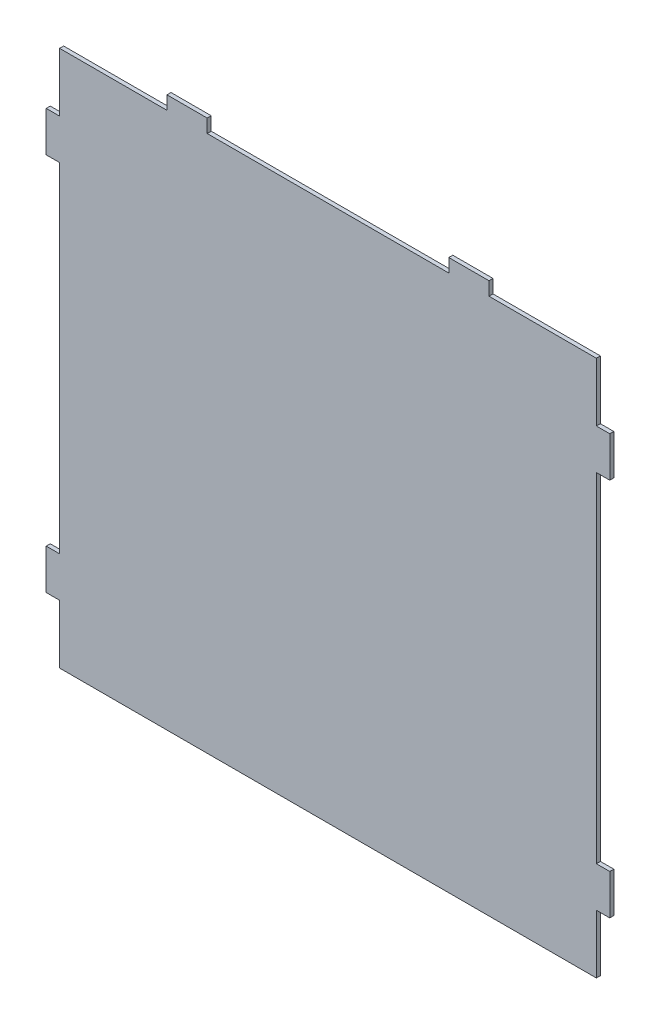
ISO-10303-21;
HEADER;
FILE_DESCRIPTION(('STEP AP214'),'2;1');
FILE_NAME('part.step','',(''),(''),'','','');
FILE_SCHEMA(('AUTOMOTIVE_DESIGN { 1 0 10303 214 1 1 1 1 }'));
ENDSEC;
DATA;
#1=APPLICATION_CONTEXT('core data for automotive mechanical design processes');
#2=APPLICATION_PROTOCOL_DEFINITION('international standard','automotive_design',2000,#1);
#3=PRODUCT_CONTEXT('',#1,'mechanical');
#4=PRODUCT('Part','Part','',(#3));
#5=PRODUCT_RELATED_PRODUCT_CATEGORY('part','',(#4));
#6=PRODUCT_DEFINITION_FORMATION('','',#4);
#7=PRODUCT_DEFINITION_CONTEXT('part definition',#1,'design');
#8=PRODUCT_DEFINITION('design','',#6,#7);
#9=PRODUCT_DEFINITION_SHAPE('','',#8);
#10=(LENGTH_UNIT() NAMED_UNIT(*) SI_UNIT(.MILLI.,.METRE.));
#11=(NAMED_UNIT(*) PLANE_ANGLE_UNIT() SI_UNIT($,.RADIAN.));
#12=(NAMED_UNIT(*) SI_UNIT($,.STERADIAN.) SOLID_ANGLE_UNIT());
#13=UNCERTAINTY_MEASURE_WITH_UNIT(LENGTH_MEASURE(1.E-05),#10,'distance_accuracy_value','');
#14=(GEOMETRIC_REPRESENTATION_CONTEXT(3) GLOBAL_UNCERTAINTY_ASSIGNED_CONTEXT((#13)) GLOBAL_UNIT_ASSIGNED_CONTEXT((#10,
#11,#12)) REPRESENTATION_CONTEXT('',''));
#15=CARTESIAN_POINT('',(0.,0.,0.));
#16=DIRECTION('',(0.,0.,1.));
#17=DIRECTION('',(1.,0.,0.));
#18=AXIS2_PLACEMENT_3D('',#15,#16,#17);
#19=CARTESIAN_POINT('',(200.,0.,3.));
#20=DIRECTION('',(1.,0.,0.));
#21=DIRECTION('',(0.,1.,0.));
#22=AXIS2_PLACEMENT_3D('',#19,#20,#21);
#23=PLANE('',#22);
#24=DIRECTION('',(0.,-1.,0.));
#25=VECTOR('',#24,1.);
#26=CARTESIAN_POINT('',(200.,0.,0.));
#27=LINE('',#26,#25);
#28=CARTESIAN_POINT('',(200.,200.,0.));
#29=VERTEX_POINT('',#28);
#30=CARTESIAN_POINT('',(200.,156.243683163479,0.));
#31=VERTEX_POINT('',#30);
#32=EDGE_CURVE('E273',#29,#31,#27,.T.);
#33=ORIENTED_EDGE('',*,*,#32,.F.);
#34=DIRECTION('',(0.,0.,-1.));
#35=VECTOR('',#34,1.);
#36=CARTESIAN_POINT('',(200.,200.,3.));
#37=LINE('',#36,#35);
#38=CARTESIAN_POINT('',(200.,200.,3.));
#39=VERTEX_POINT('',#38);
#40=EDGE_CURVE('E11',#39,#29,#37,.T.);
#41=ORIENTED_EDGE('',*,*,#40,.F.);
#42=DIRECTION('',(0.,-1.,0.));
#43=VECTOR('',#42,1.);
#44=CARTESIAN_POINT('',(200.,0.,3.));
#45=LINE('',#44,#43);
#46=CARTESIAN_POINT('',(200.,156.243683163479,3.));
#47=VERTEX_POINT('',#46);
#48=EDGE_CURVE('E267',#39,#47,#45,.T.);
#49=ORIENTED_EDGE('',*,*,#48,.T.);
#50=DIRECTION('',(0.,0.,-1.));
#51=VECTOR('',#50,1.);
#52=CARTESIAN_POINT('',(200.,156.243683163479,3.));
#53=LINE('',#52,#51);
#54=EDGE_CURVE('E161',#47,#31,#53,.T.);
#55=ORIENTED_EDGE('',*,*,#54,.T.);
#56=EDGE_LOOP('',(#33,#41,#49,#55));
#57=FACE_BOUND('',#56,.T.);
#58=ADVANCED_FACE('F49',(#57),#23,.T.);
#59=CARTESIAN_POINT('',(0.,200.,3.));
#60=DIRECTION('',(0.,1.,0.));
#61=DIRECTION('',(0.,0.,1.));
#62=AXIS2_PLACEMENT_3D('',#59,#60,#61);
#63=PLANE('',#62);
#64=DIRECTION('',(1.,0.,0.));
#65=VECTOR('',#64,1.);
#66=CARTESIAN_POINT('',(0.,200.,0.));
#67=LINE('',#66,#65);
#68=CARTESIAN_POINT('',(120.,200.,0.));
#69=VERTEX_POINT('',#68);
#70=EDGE_CURVE('E277',#69,#29,#67,.T.);
#71=ORIENTED_EDGE('',*,*,#70,.F.);
#72=DIRECTION('',(0.,0.,-1.));
#73=VECTOR('',#72,1.);
#74=CARTESIAN_POINT('',(120.,200.,3.));
#75=LINE('',#74,#73);
#76=CARTESIAN_POINT('',(120.,200.,3.));
#77=VERTEX_POINT('',#76);
#78=EDGE_CURVE('E59',#77,#69,#75,.T.);
#79=ORIENTED_EDGE('',*,*,#78,.F.);
#80=DIRECTION('',(1.,0.,0.));
#81=VECTOR('',#80,1.);
#82=CARTESIAN_POINT('',(0.,200.,3.));
#83=LINE('',#82,#81);
#84=EDGE_CURVE('E449',#77,#39,#83,.T.);
#85=ORIENTED_EDGE('',*,*,#84,.T.);
#86=ORIENTED_EDGE('',*,*,#40,.T.);
#87=EDGE_LOOP('',(#71,#79,#85,#86));
#88=FACE_BOUND('',#87,.T.);
#89=ADVANCED_FACE('F448',(#88),#63,.T.);
#90=CARTESIAN_POINT('',(120.,0.,3.));
#91=DIRECTION('',(-1.,0.,0.));
#92=DIRECTION('',(0.,0.,1.));
#93=AXIS2_PLACEMENT_3D('',#90,#91,#92);
#94=PLANE('',#93);
#95=DIRECTION('',(0.,1.,0.));
#96=VECTOR('',#95,1.);
#97=CARTESIAN_POINT('',(120.,0.,0.));
#98=LINE('',#97,#96);
#99=CARTESIAN_POINT('',(120.,210.,0.));
#100=VERTEX_POINT('',#99);
#101=EDGE_CURVE('E283',#69,#100,#98,.T.);
#102=ORIENTED_EDGE('',*,*,#101,.T.);
#103=DIRECTION('',(0.,0.,-1.));
#104=VECTOR('',#103,1.);
#105=CARTESIAN_POINT('',(120.,210.,3.));
#106=LINE('',#105,#104);
#107=CARTESIAN_POINT('',(120.,210.,3.));
#108=VERTEX_POINT('',#107);
#109=EDGE_CURVE('E433',#108,#100,#106,.T.);
#110=ORIENTED_EDGE('',*,*,#109,.F.);
#111=DIRECTION('',(0.,1.,0.));
#112=VECTOR('',#111,1.);
#113=CARTESIAN_POINT('',(120.,0.,3.));
#114=LINE('',#113,#112);
#115=EDGE_CURVE('E440',#77,#108,#114,.T.);
#116=ORIENTED_EDGE('',*,*,#115,.F.);
#117=ORIENTED_EDGE('',*,*,#78,.T.);
#118=EDGE_LOOP('',(#102,#110,#116,#117));
#119=FACE_BOUND('',#118,.T.);
#120=ADVANCED_FACE('F51',(#119),#94,.F.);
#121=CARTESIAN_POINT('',(0.,210.,3.));
#122=DIRECTION('',(0.,1.,0.));
#123=DIRECTION('',(0.,0.,1.));
#124=AXIS2_PLACEMENT_3D('',#121,#122,#123);
#125=PLANE('',#124);
#126=DIRECTION('',(1.,0.,0.));
#127=VECTOR('',#126,1.);
#128=CARTESIAN_POINT('',(0.,210.,0.));
#129=LINE('',#128,#127);
#130=CARTESIAN_POINT('',(89.9999999999999,210.,0.));
#131=VERTEX_POINT('',#130);
#132=EDGE_CURVE('E289',#131,#100,#129,.T.);
#133=ORIENTED_EDGE('',*,*,#132,.F.);
#134=DIRECTION('',(0.,0.,-1.));
#135=VECTOR('',#134,1.);
#136=CARTESIAN_POINT('',(89.9999999999999,210.,3.));
#137=LINE('',#136,#135);
#138=CARTESIAN_POINT('',(89.9999999999999,210.,3.));
#139=VERTEX_POINT('',#138);
#140=EDGE_CURVE('E430',#139,#131,#137,.T.);
#141=ORIENTED_EDGE('',*,*,#140,.F.);
#142=DIRECTION('',(1.,0.,0.));
#143=VECTOR('',#142,1.);
#144=CARTESIAN_POINT('',(0.,210.,3.));
#145=LINE('',#144,#143);
#146=EDGE_CURVE('E562',#139,#108,#145,.T.);
#147=ORIENTED_EDGE('',*,*,#146,.T.);
#148=ORIENTED_EDGE('',*,*,#109,.T.);
#149=EDGE_LOOP('',(#133,#141,#147,#148));
#150=FACE_BOUND('',#149,.T.);
#151=ADVANCED_FACE('F570',(#150),#125,.T.);
#152=CARTESIAN_POINT('',(89.9999999999999,0.,3.));
#153=DIRECTION('',(-1.,0.,0.));
#154=DIRECTION('',(0.,0.,1.));
#155=AXIS2_PLACEMENT_3D('',#152,#153,#154);
#156=PLANE('',#155);
#157=DIRECTION('',(0.,1.,0.));
#158=VECTOR('',#157,1.);
#159=CARTESIAN_POINT('',(89.9999999999999,0.,0.));
#160=LINE('',#159,#158);
#161=CARTESIAN_POINT('',(89.9999999999999,200.,0.));
#162=VERTEX_POINT('',#161);
#163=EDGE_CURVE('E293',#162,#131,#160,.T.);
#164=ORIENTED_EDGE('',*,*,#163,.F.);
#165=DIRECTION('',(0.,0.,-1.));
#166=VECTOR('',#165,1.);
#167=CARTESIAN_POINT('',(89.9999999999999,200.,3.));
#168=LINE('',#167,#166);
#169=CARTESIAN_POINT('',(89.9999999999999,200.,3.));
#170=VERTEX_POINT('',#169);
#171=EDGE_CURVE('E427',#170,#162,#168,.T.);
#172=ORIENTED_EDGE('',*,*,#171,.F.);
#173=DIRECTION('',(0.,1.,0.));
#174=VECTOR('',#173,1.);
#175=CARTESIAN_POINT('',(89.9999999999999,0.,3.));
#176=LINE('',#175,#174);
#177=EDGE_CURVE('E558',#170,#139,#176,.T.);
#178=ORIENTED_EDGE('',*,*,#177,.T.);
#179=ORIENTED_EDGE('',*,*,#140,.T.);
#180=EDGE_LOOP('',(#164,#172,#178,#179));
#181=FACE_BOUND('',#180,.T.);
#182=ADVANCED_FACE('F573',(#181),#156,.T.);
#183=CARTESIAN_POINT('',(-90.0000000000001,200.,0.));
#184=VERTEX_POINT('',#183);
#185=EDGE_CURVE('E285',#184,#162,#67,.T.);
#186=ORIENTED_EDGE('',*,*,#185,.F.);
#187=DIRECTION('',(0.,0.,-1.));
#188=VECTOR('',#187,1.);
#189=CARTESIAN_POINT('',(-90.0000000000001,200.,3.));
#190=LINE('',#189,#188);
#191=CARTESIAN_POINT('',(-90.0000000000001,200.,3.));
#192=VERTEX_POINT('',#191);
#193=EDGE_CURVE('E424',#192,#184,#190,.T.);
#194=ORIENTED_EDGE('',*,*,#193,.F.);
#195=EDGE_CURVE('E457',#192,#170,#83,.T.);
#196=ORIENTED_EDGE('',*,*,#195,.T.);
#197=ORIENTED_EDGE('',*,*,#171,.T.);
#198=EDGE_LOOP('',(#186,#194,#196,#197));
#199=FACE_BOUND('',#198,.T.);
#200=ADVANCED_FACE('F579',(#199),#63,.T.);
#201=CARTESIAN_POINT('',(-90.0000000000001,0.,3.));
#202=DIRECTION('',(-1.,0.,0.));
#203=DIRECTION('',(0.,0.,1.));
#204=AXIS2_PLACEMENT_3D('',#201,#202,#203);
#205=PLANE('',#204);
#206=DIRECTION('',(0.,1.,0.));
#207=VECTOR('',#206,1.);
#208=CARTESIAN_POINT('',(-90.0000000000001,0.,0.));
#209=LINE('',#208,#207);
#210=CARTESIAN_POINT('',(-90.0000000000001,210.,0.));
#211=VERTEX_POINT('',#210);
#212=EDGE_CURVE('E297',#184,#211,#209,.T.);
#213=ORIENTED_EDGE('',*,*,#212,.T.);
#214=DIRECTION('',(0.,0.,-1.));
#215=VECTOR('',#214,1.);
#216=CARTESIAN_POINT('',(-90.0000000000001,210.,3.));
#217=LINE('',#216,#215);
#218=CARTESIAN_POINT('',(-90.0000000000001,210.,3.));
#219=VERTEX_POINT('',#218);
#220=EDGE_CURVE('E420',#219,#211,#217,.T.);
#221=ORIENTED_EDGE('',*,*,#220,.F.);
#222=DIRECTION('',(0.,1.,0.));
#223=VECTOR('',#222,1.);
#224=CARTESIAN_POINT('',(-90.0000000000001,0.,3.));
#225=LINE('',#224,#223);
#226=EDGE_CURVE('E555',#192,#219,#225,.T.);
#227=ORIENTED_EDGE('',*,*,#226,.F.);
#228=ORIENTED_EDGE('',*,*,#193,.T.);
#229=EDGE_LOOP('',(#213,#221,#227,#228));
#230=FACE_BOUND('',#229,.T.);
#231=ADVANCED_FACE('F605',(#230),#205,.F.);
#232=CARTESIAN_POINT('',(-1.94289029309402E-13,210.,3.));
#233=DIRECTION('',(0.,-1.,0.));
#234=DIRECTION('',(1.,0.,0.));
#235=AXIS2_PLACEMENT_3D('',#232,#233,#234);
#236=PLANE('',#235);
#237=DIRECTION('',(-1.,0.,0.));
#238=VECTOR('',#237,1.);
#239=CARTESIAN_POINT('',(-1.94289029309402E-13,210.,0.));
#240=LINE('',#239,#238);
#241=CARTESIAN_POINT('',(-120.,210.,0.));
#242=VERTEX_POINT('',#241);
#243=EDGE_CURVE('E300',#211,#242,#240,.T.);
#244=ORIENTED_EDGE('',*,*,#243,.T.);
#245=DIRECTION('',(0.,0.,-1.));
#246=VECTOR('',#245,1.);
#247=CARTESIAN_POINT('',(-120.,210.,3.));
#248=LINE('',#247,#246);
#249=CARTESIAN_POINT('',(-120.,210.,3.));
#250=VERTEX_POINT('',#249);
#251=EDGE_CURVE('E417',#250,#242,#248,.T.);
#252=ORIENTED_EDGE('',*,*,#251,.F.);
#253=DIRECTION('',(-1.,0.,0.));
#254=VECTOR('',#253,1.);
#255=CARTESIAN_POINT('',(-1.94289029309402E-13,210.,3.));
#256=LINE('',#255,#254);
#257=EDGE_CURVE('E552',#219,#250,#256,.T.);
#258=ORIENTED_EDGE('',*,*,#257,.F.);
#259=ORIENTED_EDGE('',*,*,#220,.T.);
#260=EDGE_LOOP('',(#244,#252,#258,#259));
#261=FACE_BOUND('',#260,.T.);
#262=ADVANCED_FACE('F607',(#261),#236,.F.);
#263=CARTESIAN_POINT('',(-120.,0.,3.));
#264=DIRECTION('',(-1.,0.,0.));
#265=DIRECTION('',(0.,0.,1.));
#266=AXIS2_PLACEMENT_3D('',#263,#264,#265);
#267=PLANE('',#266);
#268=DIRECTION('',(0.,1.,0.));
#269=VECTOR('',#268,1.);
#270=CARTESIAN_POINT('',(-120.,0.,0.));
#271=LINE('',#270,#269);
#272=CARTESIAN_POINT('',(-120.,200.,0.));
#273=VERTEX_POINT('',#272);
#274=EDGE_CURVE('E304',#273,#242,#271,.T.);
#275=ORIENTED_EDGE('',*,*,#274,.F.);
#276=DIRECTION('',(0.,0.,-1.));
#277=VECTOR('',#276,1.);
#278=CARTESIAN_POINT('',(-120.,200.,3.));
#279=LINE('',#278,#277);
#280=CARTESIAN_POINT('',(-120.,200.,3.));
#281=VERTEX_POINT('',#280);
#282=EDGE_CURVE('E414',#281,#273,#279,.T.);
#283=ORIENTED_EDGE('',*,*,#282,.F.);
#284=DIRECTION('',(0.,1.,0.));
#285=VECTOR('',#284,1.);
#286=CARTESIAN_POINT('',(-120.,0.,3.));
#287=LINE('',#286,#285);
#288=EDGE_CURVE('E548',#281,#250,#287,.T.);
#289=ORIENTED_EDGE('',*,*,#288,.T.);
#290=ORIENTED_EDGE('',*,*,#251,.T.);
#291=EDGE_LOOP('',(#275,#283,#289,#290));
#292=FACE_BOUND('',#291,.T.);
#293=ADVANCED_FACE('F595',(#292),#267,.T.);
#294=CARTESIAN_POINT('',(-200.,200.,0.));
#295=VERTEX_POINT('',#294);
#296=EDGE_CURVE('E284',#295,#273,#67,.T.);
#297=ORIENTED_EDGE('',*,*,#296,.F.);
#298=DIRECTION('',(0.,0.,-1.));
#299=VECTOR('',#298,1.);
#300=CARTESIAN_POINT('',(-200.,200.,3.));
#301=LINE('',#300,#299);
#302=CARTESIAN_POINT('',(-200.,200.,3.));
#303=VERTEX_POINT('',#302);
#304=EDGE_CURVE('E411',#303,#295,#301,.T.);
#305=ORIENTED_EDGE('',*,*,#304,.F.);
#306=EDGE_CURVE('E456',#303,#281,#83,.T.);
#307=ORIENTED_EDGE('',*,*,#306,.T.);
#308=ORIENTED_EDGE('',*,*,#282,.T.);
#309=EDGE_LOOP('',(#297,#305,#307,#308));
#310=FACE_BOUND('',#309,.T.);
#311=ADVANCED_FACE('F587',(#310),#63,.T.);
#312=CARTESIAN_POINT('',(-200.,0.,3.));
#313=DIRECTION('',(1.,0.,0.));
#314=DIRECTION('',(0.,1.,0.));
#315=AXIS2_PLACEMENT_3D('',#312,#313,#314);
#316=PLANE('',#315);
#317=DIRECTION('',(0.,-1.,0.));
#318=VECTOR('',#317,1.);
#319=CARTESIAN_POINT('',(-200.,0.,0.));
#320=LINE('',#319,#318);
#321=CARTESIAN_POINT('',(-200.,156.243683163479,0.));
#322=VERTEX_POINT('',#321);
#323=EDGE_CURVE('E308',#295,#322,#320,.T.);
#324=ORIENTED_EDGE('',*,*,#323,.T.);
#325=DIRECTION('',(0.,0.,-1.));
#326=VECTOR('',#325,1.);
#327=CARTESIAN_POINT('',(-200.,156.243683163479,3.));
#328=LINE('',#327,#326);
#329=CARTESIAN_POINT('',(-200.,156.243683163479,3.));
#330=VERTEX_POINT('',#329);
#331=EDGE_CURVE('E407',#330,#322,#328,.T.);
#332=ORIENTED_EDGE('',*,*,#331,.F.);
#333=DIRECTION('',(0.,-1.,0.));
#334=VECTOR('',#333,1.);
#335=CARTESIAN_POINT('',(-200.,0.,3.));
#336=LINE('',#335,#334);
#337=EDGE_CURVE('E476',#303,#330,#336,.T.);
#338=ORIENTED_EDGE('',*,*,#337,.F.);
#339=ORIENTED_EDGE('',*,*,#304,.T.);
#340=EDGE_LOOP('',(#324,#332,#338,#339));
#341=FACE_BOUND('',#340,.T.);
#342=ADVANCED_FACE('F645',(#341),#316,.F.);
#343=CARTESIAN_POINT('',(0.,156.243683163479,3.));
#344=DIRECTION('',(0.,-1.,0.));
#345=DIRECTION('',(0.,0.,-1.));
#346=AXIS2_PLACEMENT_3D('',#343,#344,#345);
#347=PLANE('',#346);
#348=DIRECTION('',(-1.,0.,0.));
#349=VECTOR('',#348,1.);
#350=CARTESIAN_POINT('',(0.,156.243683163479,0.));
#351=LINE('',#350,#349);
#352=CARTESIAN_POINT('',(-210.,156.243683163479,0.));
#353=VERTEX_POINT('',#352);
#354=EDGE_CURVE('E311',#322,#353,#351,.T.);
#355=ORIENTED_EDGE('',*,*,#354,.T.);
#356=DIRECTION('',(0.,0.,-1.));
#357=VECTOR('',#356,1.);
#358=CARTESIAN_POINT('',(-210.,156.243683163479,3.));
#359=LINE('',#358,#357);
#360=CARTESIAN_POINT('',(-210.,156.243683163479,3.));
#361=VERTEX_POINT('',#360);
#362=EDGE_CURVE('E404',#361,#353,#359,.T.);
#363=ORIENTED_EDGE('',*,*,#362,.F.);
#364=DIRECTION('',(-1.,0.,0.));
#365=VECTOR('',#364,1.);
#366=CARTESIAN_POINT('',(0.,156.243683163479,3.));
#367=LINE('',#366,#365);
#368=EDGE_CURVE('E544',#330,#361,#367,.T.);
#369=ORIENTED_EDGE('',*,*,#368,.F.);
#370=ORIENTED_EDGE('',*,*,#331,.T.);
#371=EDGE_LOOP('',(#355,#363,#369,#370));
#372=FACE_BOUND('',#371,.T.);
#373=ADVANCED_FACE('F660',(#372),#347,.F.);
#374=CARTESIAN_POINT('',(-210.,0.,3.));
#375=DIRECTION('',(-1.,0.,0.));
#376=DIRECTION('',(0.,0.,1.));
#377=AXIS2_PLACEMENT_3D('',#374,#375,#376);
#378=PLANE('',#377);
#379=DIRECTION('',(0.,1.,0.));
#380=VECTOR('',#379,1.);
#381=CARTESIAN_POINT('',(-210.,0.,0.));
#382=LINE('',#381,#380);
#383=CARTESIAN_POINT('',(-210.,126.243683163479,0.));
#384=VERTEX_POINT('',#383);
#385=EDGE_CURVE('E317',#384,#353,#382,.T.);
#386=ORIENTED_EDGE('',*,*,#385,.F.);
#387=DIRECTION('',(0.,0.,-1.));
#388=VECTOR('',#387,1.);
#389=CARTESIAN_POINT('',(-210.,126.243683163479,3.));
#390=LINE('',#389,#388);
#391=CARTESIAN_POINT('',(-210.,126.243683163479,3.));
#392=VERTEX_POINT('',#391);
#393=EDGE_CURVE('E401',#392,#384,#390,.T.);
#394=ORIENTED_EDGE('',*,*,#393,.F.);
#395=DIRECTION('',(0.,1.,0.));
#396=VECTOR('',#395,1.);
#397=CARTESIAN_POINT('',(-210.,0.,3.));
#398=LINE('',#397,#396);
#399=EDGE_CURVE('E540',#392,#361,#398,.T.);
#400=ORIENTED_EDGE('',*,*,#399,.T.);
#401=ORIENTED_EDGE('',*,*,#362,.T.);
#402=EDGE_LOOP('',(#386,#394,#400,#401));
#403=FACE_BOUND('',#402,.T.);
#404=ADVANCED_FACE('F656',(#403),#378,.T.);
#405=CARTESIAN_POINT('',(0.,126.243683163479,3.));
#406=DIRECTION('',(0.,-1.,0.));
#407=DIRECTION('',(0.,0.,-1.));
#408=AXIS2_PLACEMENT_3D('',#405,#406,#407);
#409=PLANE('',#408);
#410=DIRECTION('',(-1.,0.,0.));
#411=VECTOR('',#410,1.);
#412=CARTESIAN_POINT('',(0.,126.243683163479,0.));
#413=LINE('',#412,#411);
#414=CARTESIAN_POINT('',(-200.,126.243683163479,0.));
#415=VERTEX_POINT('',#414);
#416=EDGE_CURVE('E321',#415,#384,#413,.T.);
#417=ORIENTED_EDGE('',*,*,#416,.F.);
#418=DIRECTION('',(0.,0.,-1.));
#419=VECTOR('',#418,1.);
#420=CARTESIAN_POINT('',(-200.,126.243683163479,3.));
#421=LINE('',#420,#419);
#422=CARTESIAN_POINT('',(-200.,126.243683163479,3.));
#423=VERTEX_POINT('',#422);
#424=EDGE_CURVE('E398',#423,#415,#421,.T.);
#425=ORIENTED_EDGE('',*,*,#424,.F.);
#426=DIRECTION('',(-1.,0.,0.));
#427=VECTOR('',#426,1.);
#428=CARTESIAN_POINT('',(0.,126.243683163479,3.));
#429=LINE('',#428,#427);
#430=EDGE_CURVE('E536',#423,#392,#429,.T.);
#431=ORIENTED_EDGE('',*,*,#430,.T.);
#432=ORIENTED_EDGE('',*,*,#393,.T.);
#433=EDGE_LOOP('',(#417,#425,#431,#432));
#434=FACE_BOUND('',#433,.T.);
#435=ADVANCED_FACE('F653',(#434),#409,.T.);
#436=CARTESIAN_POINT('',(-200.,-126.243683163479,0.));
#437=VERTEX_POINT('',#436);
#438=EDGE_CURVE('E313',#415,#437,#320,.T.);
#439=ORIENTED_EDGE('',*,*,#438,.T.);
#440=DIRECTION('',(0.,0.,-1.));
#441=VECTOR('',#440,1.);
#442=CARTESIAN_POINT('',(-200.,-126.243683163479,3.));
#443=LINE('',#442,#441);
#444=CARTESIAN_POINT('',(-200.,-126.243683163479,3.));
#445=VERTEX_POINT('',#444);
#446=EDGE_CURVE('E394',#445,#437,#443,.T.);
#447=ORIENTED_EDGE('',*,*,#446,.F.);
#448=EDGE_CURVE('E475',#423,#445,#336,.T.);
#449=ORIENTED_EDGE('',*,*,#448,.F.);
#450=ORIENTED_EDGE('',*,*,#424,.T.);
#451=EDGE_LOOP('',(#439,#447,#449,#450));
#452=FACE_BOUND('',#451,.T.);
#453=ADVANCED_FACE('F515',(#452),#316,.F.);
#454=CARTESIAN_POINT('',(0.,-126.243683163479,3.));
#455=DIRECTION('',(0.,-1.,0.));
#456=DIRECTION('',(0.,0.,-1.));
#457=AXIS2_PLACEMENT_3D('',#454,#455,#456);
#458=PLANE('',#457);
#459=DIRECTION('',(-1.,0.,0.));
#460=VECTOR('',#459,1.);
#461=CARTESIAN_POINT('',(0.,-126.243683163479,0.));
#462=LINE('',#461,#460);
#463=CARTESIAN_POINT('',(-210.,-126.243683163479,0.));
#464=VERTEX_POINT('',#463);
#465=EDGE_CURVE('E325',#437,#464,#462,.T.);
#466=ORIENTED_EDGE('',*,*,#465,.T.);
#467=DIRECTION('',(0.,0.,-1.));
#468=VECTOR('',#467,1.);
#469=CARTESIAN_POINT('',(-210.,-126.243683163479,3.));
#470=LINE('',#469,#468);
#471=CARTESIAN_POINT('',(-210.,-126.243683163479,3.));
#472=VERTEX_POINT('',#471);
#473=EDGE_CURVE('E390',#472,#464,#470,.T.);
#474=ORIENTED_EDGE('',*,*,#473,.F.);
#475=DIRECTION('',(-1.,0.,0.));
#476=VECTOR('',#475,1.);
#477=CARTESIAN_POINT('',(0.,-126.243683163479,3.));
#478=LINE('',#477,#476);
#479=EDGE_CURVE('E523',#445,#472,#478,.T.);
#480=ORIENTED_EDGE('',*,*,#479,.F.);
#481=ORIENTED_EDGE('',*,*,#446,.T.);
#482=EDGE_LOOP('',(#466,#474,#480,#481));
#483=FACE_BOUND('',#482,.T.);
#484=ADVANCED_FACE('F521',(#483),#458,.F.);
#485=CARTESIAN_POINT('',(-210.,0.,3.));
#486=DIRECTION('',(1.,0.,0.));
#487=DIRECTION('',(0.,0.,-1.));
#488=AXIS2_PLACEMENT_3D('',#485,#486,#487);
#489=PLANE('',#488);
#490=DIRECTION('',(0.,-1.,0.));
#491=VECTOR('',#490,1.);
#492=CARTESIAN_POINT('',(-210.,0.,0.));
#493=LINE('',#492,#491);
#494=CARTESIAN_POINT('',(-210.,-156.243683163479,0.));
#495=VERTEX_POINT('',#494);
#496=EDGE_CURVE('E328',#464,#495,#493,.T.);
#497=ORIENTED_EDGE('',*,*,#496,.T.);
#498=DIRECTION('',(0.,0.,-1.));
#499=VECTOR('',#498,1.);
#500=CARTESIAN_POINT('',(-210.,-156.243683163479,3.));
#501=LINE('',#500,#499);
#502=CARTESIAN_POINT('',(-210.,-156.243683163479,3.));
#503=VERTEX_POINT('',#502);
#504=EDGE_CURVE('E387',#503,#495,#501,.T.);
#505=ORIENTED_EDGE('',*,*,#504,.F.);
#506=DIRECTION('',(0.,-1.,0.));
#507=VECTOR('',#506,1.);
#508=CARTESIAN_POINT('',(-210.,0.,3.));
#509=LINE('',#508,#507);
#510=EDGE_CURVE('E530',#472,#503,#509,.T.);
#511=ORIENTED_EDGE('',*,*,#510,.F.);
#512=ORIENTED_EDGE('',*,*,#473,.T.);
#513=EDGE_LOOP('',(#497,#505,#511,#512));
#514=FACE_BOUND('',#513,.T.);
#515=ADVANCED_FACE('F527',(#514),#489,.F.);
#516=CARTESIAN_POINT('',(0.,-156.243683163479,3.));
#517=DIRECTION('',(0.,-1.,0.));
#518=DIRECTION('',(0.,0.,-1.));
#519=AXIS2_PLACEMENT_3D('',#516,#517,#518);
#520=PLANE('',#519);
#521=DIRECTION('',(-1.,0.,0.));
#522=VECTOR('',#521,1.);
#523=CARTESIAN_POINT('',(0.,-156.243683163479,0.));
#524=LINE('',#523,#522);
#525=CARTESIAN_POINT('',(-200.,-156.243683163479,0.));
#526=VERTEX_POINT('',#525);
#527=EDGE_CURVE('E332',#526,#495,#524,.T.);
#528=ORIENTED_EDGE('',*,*,#527,.F.);
#529=DIRECTION('',(0.,0.,-1.));
#530=VECTOR('',#529,1.);
#531=CARTESIAN_POINT('',(-200.,-156.243683163479,3.));
#532=LINE('',#531,#530);
#533=CARTESIAN_POINT('',(-200.,-156.243683163479,3.));
#534=VERTEX_POINT('',#533);
#535=EDGE_CURVE('E384',#534,#526,#532,.T.);
#536=ORIENTED_EDGE('',*,*,#535,.F.);
#537=DIRECTION('',(-1.,0.,0.));
#538=VECTOR('',#537,1.);
#539=CARTESIAN_POINT('',(0.,-156.243683163479,3.));
#540=LINE('',#539,#538);
#541=EDGE_CURVE('E473',#534,#503,#540,.T.);
#542=ORIENTED_EDGE('',*,*,#541,.T.);
#543=ORIENTED_EDGE('',*,*,#504,.T.);
#544=EDGE_LOOP('',(#528,#536,#542,#543));
#545=FACE_BOUND('',#544,.T.);
#546=ADVANCED_FACE('F644',(#545),#520,.T.);
#547=CARTESIAN_POINT('',(-200.,-200.,0.));
#548=VERTEX_POINT('',#547);
#549=EDGE_CURVE('E312',#526,#548,#320,.T.);
#550=ORIENTED_EDGE('',*,*,#549,.T.);
#551=DIRECTION('',(0.,0.,-1.));
#552=VECTOR('',#551,1.);
#553=CARTESIAN_POINT('',(-200.,-200.,3.));
#554=LINE('',#553,#552);
#555=CARTESIAN_POINT('',(-200.,-200.,3.));
#556=VERTEX_POINT('',#555);
#557=EDGE_CURVE('E380',#556,#548,#554,.T.);
#558=ORIENTED_EDGE('',*,*,#557,.F.);
#559=EDGE_CURVE('E468',#534,#556,#336,.T.);
#560=ORIENTED_EDGE('',*,*,#559,.F.);
#561=ORIENTED_EDGE('',*,*,#535,.T.);
#562=EDGE_LOOP('',(#550,#558,#560,#561));
#563=FACE_BOUND('',#562,.T.);
#564=ADVANCED_FACE('F507',(#563),#316,.F.);
#565=CARTESIAN_POINT('',(0.,-200.,3.));
#566=DIRECTION('',(0.,1.,0.));
#567=DIRECTION('',(0.,0.,1.));
#568=AXIS2_PLACEMENT_3D('',#565,#566,#567);
#569=PLANE('',#568);
#570=DIRECTION('',(1.,0.,0.));
#571=VECTOR('',#570,1.);
#572=CARTESIAN_POINT('',(0.,-200.,0.));
#573=LINE('',#572,#571);
#574=CARTESIAN_POINT('',(200.,-200.,0.));
#575=VERTEX_POINT('',#574);
#576=EDGE_CURVE('E336',#548,#575,#573,.T.);
#577=ORIENTED_EDGE('',*,*,#576,.T.);
#578=DIRECTION('',(0.,0.,-1.));
#579=VECTOR('',#578,1.);
#580=CARTESIAN_POINT('',(200.,-200.,3.));
#581=LINE('',#580,#579);
#582=CARTESIAN_POINT('',(200.,-200.,3.));
#583=VERTEX_POINT('',#582);
#584=EDGE_CURVE('E377',#583,#575,#581,.T.);
#585=ORIENTED_EDGE('',*,*,#584,.F.);
#586=DIRECTION('',(1.,0.,0.));
#587=VECTOR('',#586,1.);
#588=CARTESIAN_POINT('',(0.,-200.,3.));
#589=LINE('',#588,#587);
#590=EDGE_CURVE('E461',#556,#583,#589,.T.);
#591=ORIENTED_EDGE('',*,*,#590,.F.);
#592=ORIENTED_EDGE('',*,*,#557,.T.);
#593=EDGE_LOOP('',(#577,#585,#591,#592));
#594=FACE_BOUND('',#593,.T.);
#595=ADVANCED_FACE('F503',(#594),#569,.F.);
#596=CARTESIAN_POINT('',(200.,-156.243683163479,0.));
#597=VERTEX_POINT('',#596);
#598=EDGE_CURVE('E279',#597,#575,#27,.T.);
#599=ORIENTED_EDGE('',*,*,#598,.F.);
#600=DIRECTION('',(0.,0.,-1.));
#601=VECTOR('',#600,1.);
#602=CARTESIAN_POINT('',(200.,-156.243683163479,3.));
#603=LINE('',#602,#601);
#604=CARTESIAN_POINT('',(200.,-156.243683163479,3.));
#605=VERTEX_POINT('',#604);
#606=EDGE_CURVE('E374',#605,#597,#603,.T.);
#607=ORIENTED_EDGE('',*,*,#606,.F.);
#608=EDGE_CURVE('E266',#605,#583,#45,.T.);
#609=ORIENTED_EDGE('',*,*,#608,.T.);
#610=ORIENTED_EDGE('',*,*,#584,.T.);
#611=EDGE_LOOP('',(#599,#607,#609,#610));
#612=FACE_BOUND('',#611,.T.);
#613=ADVANCED_FACE('F500',(#612),#23,.T.);
#614=CARTESIAN_POINT('',(0.,-156.243683163479,3.));
#615=DIRECTION('',(0.,1.,0.));
#616=DIRECTION('',(0.,0.,1.));
#617=AXIS2_PLACEMENT_3D('',#614,#615,#616);
#618=PLANE('',#617);
#619=DIRECTION('',(1.,0.,0.));
#620=VECTOR('',#619,1.);
#621=CARTESIAN_POINT('',(0.,-156.243683163479,0.));
#622=LINE('',#621,#620);
#623=CARTESIAN_POINT('',(210.,-156.243683163479,0.));
#624=VERTEX_POINT('',#623);
#625=EDGE_CURVE('E340',#597,#624,#622,.T.);
#626=ORIENTED_EDGE('',*,*,#625,.T.);
#627=DIRECTION('',(0.,0.,-1.));
#628=VECTOR('',#627,1.);
#629=CARTESIAN_POINT('',(210.,-156.243683163479,3.));
#630=LINE('',#629,#628);
#631=CARTESIAN_POINT('',(210.,-156.243683163479,3.));
#632=VERTEX_POINT('',#631);
#633=EDGE_CURVE('E371',#632,#624,#630,.T.);
#634=ORIENTED_EDGE('',*,*,#633,.F.);
#635=DIRECTION('',(1.,0.,0.));
#636=VECTOR('',#635,1.);
#637=CARTESIAN_POINT('',(0.,-156.243683163479,3.));
#638=LINE('',#637,#636);
#639=EDGE_CURVE('E460',#605,#632,#638,.T.);
#640=ORIENTED_EDGE('',*,*,#639,.F.);
#641=ORIENTED_EDGE('',*,*,#606,.T.);
#642=EDGE_LOOP('',(#626,#634,#640,#641));
#643=FACE_BOUND('',#642,.T.);
#644=ADVANCED_FACE('F625',(#643),#618,.F.);
#645=CARTESIAN_POINT('',(210.,3.88578058618805E-13,3.));
#646=DIRECTION('',(1.,0.,0.));
#647=DIRECTION('',(0.,1.,0.));
#648=AXIS2_PLACEMENT_3D('',#645,#646,#647);
#649=PLANE('',#648);
#650=DIRECTION('',(0.,-1.,0.));
#651=VECTOR('',#650,1.);
#652=CARTESIAN_POINT('',(210.,3.88578058618805E-13,0.));
#653=LINE('',#652,#651);
#654=CARTESIAN_POINT('',(210.,-126.243683163479,0.));
#655=VERTEX_POINT('',#654);
#656=EDGE_CURVE('E344',#655,#624,#653,.T.);
#657=ORIENTED_EDGE('',*,*,#656,.F.);
#658=DIRECTION('',(0.,0.,-1.));
#659=VECTOR('',#658,1.);
#660=CARTESIAN_POINT('',(210.,-126.243683163479,3.));
#661=LINE('',#660,#659);
#662=CARTESIAN_POINT('',(210.,-126.243683163479,3.));
#663=VERTEX_POINT('',#662);
#664=EDGE_CURVE('E368',#663,#655,#661,.T.);
#665=ORIENTED_EDGE('',*,*,#664,.F.);
#666=DIRECTION('',(0.,-1.,0.));
#667=VECTOR('',#666,1.);
#668=CARTESIAN_POINT('',(210.,3.88578058618805E-13,3.));
#669=LINE('',#668,#667);
#670=EDGE_CURVE('E466',#663,#632,#669,.T.);
#671=ORIENTED_EDGE('',*,*,#670,.T.);
#672=ORIENTED_EDGE('',*,*,#633,.T.);
#673=EDGE_LOOP('',(#657,#665,#671,#672));
#674=FACE_BOUND('',#673,.T.);
#675=ADVANCED_FACE('F631',(#674),#649,.T.);
#676=CARTESIAN_POINT('',(0.,-126.243683163479,3.));
#677=DIRECTION('',(0.,1.,0.));
#678=DIRECTION('',(0.,0.,1.));
#679=AXIS2_PLACEMENT_3D('',#676,#677,#678);
#680=PLANE('',#679);
#681=DIRECTION('',(1.,0.,0.));
#682=VECTOR('',#681,1.);
#683=CARTESIAN_POINT('',(0.,-126.243683163479,0.));
#684=LINE('',#683,#682);
#685=CARTESIAN_POINT('',(200.,-126.243683163479,0.));
#686=VERTEX_POINT('',#685);
#687=EDGE_CURVE('E348',#686,#655,#684,.T.);
#688=ORIENTED_EDGE('',*,*,#687,.F.);
#689=DIRECTION('',(0.,0.,-1.));
#690=VECTOR('',#689,1.);
#691=CARTESIAN_POINT('',(200.,-126.243683163479,3.));
#692=LINE('',#691,#690);
#693=CARTESIAN_POINT('',(200.,-126.243683163479,3.));
#694=VERTEX_POINT('',#693);
#695=EDGE_CURVE('E365',#694,#686,#692,.T.);
#696=ORIENTED_EDGE('',*,*,#695,.F.);
#697=DIRECTION('',(1.,0.,0.));
#698=VECTOR('',#697,1.);
#699=CARTESIAN_POINT('',(0.,-126.243683163479,3.));
#700=LINE('',#699,#698);
#701=EDGE_CURVE('E264',#694,#663,#700,.T.);
#702=ORIENTED_EDGE('',*,*,#701,.T.);
#703=ORIENTED_EDGE('',*,*,#664,.T.);
#704=EDGE_LOOP('',(#688,#696,#702,#703));
#705=FACE_BOUND('',#704,.T.);
#706=ADVANCED_FACE('F487',(#705),#680,.T.);
#707=CARTESIAN_POINT('',(200.,126.243683163479,0.));
#708=VERTEX_POINT('',#707);
#709=EDGE_CURVE('E278',#708,#686,#27,.T.);
#710=ORIENTED_EDGE('',*,*,#709,.F.);
#711=DIRECTION('',(0.,0.,-1.));
#712=VECTOR('',#711,1.);
#713=CARTESIAN_POINT('',(200.,126.243683163479,3.));
#714=LINE('',#713,#712);
#715=CARTESIAN_POINT('',(200.,126.243683163479,3.));
#716=VERTEX_POINT('',#715);
#717=EDGE_CURVE('E249',#716,#708,#714,.T.);
#718=ORIENTED_EDGE('',*,*,#717,.F.);
#719=EDGE_CURVE('E260',#716,#694,#45,.T.);
#720=ORIENTED_EDGE('',*,*,#719,.T.);
#721=ORIENTED_EDGE('',*,*,#695,.T.);
#722=EDGE_LOOP('',(#710,#718,#720,#721));
#723=FACE_BOUND('',#722,.T.);
#724=ADVANCED_FACE('F491',(#723),#23,.T.);
#725=CARTESIAN_POINT('',(0.,126.243683163479,3.));
#726=DIRECTION('',(0.,-1.,0.));
#727=DIRECTION('',(0.,0.,-1.));
#728=AXIS2_PLACEMENT_3D('',#725,#726,#727);
#729=PLANE('',#728);
#730=DIRECTION('',(-1.,0.,0.));
#731=VECTOR('',#730,1.);
#732=CARTESIAN_POINT('',(0.,126.243683163479,0.));
#733=LINE('',#732,#731);
#734=CARTESIAN_POINT('',(210.,126.243683163479,0.));
#735=VERTEX_POINT('',#734);
#736=EDGE_CURVE('E247',#735,#708,#733,.T.);
#737=ORIENTED_EDGE('',*,*,#736,.F.);
#738=DIRECTION('',(0.,0.,-1.));
#739=VECTOR('',#738,1.);
#740=CARTESIAN_POINT('',(210.,126.243683163479,3.));
#741=LINE('',#740,#739);
#742=CARTESIAN_POINT('',(210.,126.243683163479,3.));
#743=VERTEX_POINT('',#742);
#744=EDGE_CURVE('E241',#743,#735,#741,.T.);
#745=ORIENTED_EDGE('',*,*,#744,.F.);
#746=DIRECTION('',(-1.,0.,0.));
#747=VECTOR('',#746,1.);
#748=CARTESIAN_POINT('',(0.,126.243683163479,3.));
#749=LINE('',#748,#747);
#750=EDGE_CURVE('E245',#743,#716,#749,.T.);
#751=ORIENTED_EDGE('',*,*,#750,.T.);
#752=ORIENTED_EDGE('',*,*,#717,.T.);
#753=EDGE_LOOP('',(#737,#745,#751,#752));
#754=FACE_BOUND('',#753,.T.);
#755=ADVANCED_FACE('F243',(#754),#729,.T.);
#756=CARTESIAN_POINT('',(210.,3.88578058618805E-13,3.));
#757=DIRECTION('',(-1.,0.,0.));
#758=DIRECTION('',(0.,-1.,0.));
#759=AXIS2_PLACEMENT_3D('',#756,#757,#758);
#760=PLANE('',#759);
#761=DIRECTION('',(0.,1.,0.));
#762=VECTOR('',#761,1.);
#763=CARTESIAN_POINT('',(210.,3.88578058618805E-13,0.));
#764=LINE('',#763,#762);
#765=CARTESIAN_POINT('',(210.,156.243683163479,0.));
#766=VERTEX_POINT('',#765);
#767=EDGE_CURVE('E154',#735,#766,#764,.T.);
#768=ORIENTED_EDGE('',*,*,#767,.T.);
#769=DIRECTION('',(0.,0.,-1.));
#770=VECTOR('',#769,1.);
#771=CARTESIAN_POINT('',(210.,156.243683163479,3.));
#772=LINE('',#771,#770);
#773=CARTESIAN_POINT('',(210.,156.243683163479,3.));
#774=VERTEX_POINT('',#773);
#775=EDGE_CURVE('E250',#774,#766,#772,.T.);
#776=ORIENTED_EDGE('',*,*,#775,.F.);
#777=DIRECTION('',(0.,1.,0.));
#778=VECTOR('',#777,1.);
#779=CARTESIAN_POINT('',(210.,3.88578058618805E-13,3.));
#780=LINE('',#779,#778);
#781=EDGE_CURVE('E252',#743,#774,#780,.T.);
#782=ORIENTED_EDGE('',*,*,#781,.F.);
#783=ORIENTED_EDGE('',*,*,#744,.T.);
#784=EDGE_LOOP('',(#768,#776,#782,#783));
#785=FACE_BOUND('',#784,.T.);
#786=ADVANCED_FACE('F253',(#785),#760,.F.);
#787=CARTESIAN_POINT('',(0.,156.243683163479,3.));
#788=DIRECTION('',(0.,-1.,0.));
#789=DIRECTION('',(0.,0.,-1.));
#790=AXIS2_PLACEMENT_3D('',#787,#788,#789);
#791=PLANE('',#790);
#792=DIRECTION('',(-1.,0.,0.));
#793=VECTOR('',#792,1.);
#794=CARTESIAN_POINT('',(0.,156.243683163479,0.));
#795=LINE('',#794,#793);
#796=EDGE_CURVE('E356',#766,#31,#795,.T.);
#797=ORIENTED_EDGE('',*,*,#796,.T.);
#798=ORIENTED_EDGE('',*,*,#54,.F.);
#799=DIRECTION('',(-1.,0.,0.));
#800=VECTOR('',#799,1.);
#801=CARTESIAN_POINT('',(0.,156.243683163479,3.));
#802=LINE('',#801,#800);
#803=EDGE_CURVE('E67',#774,#47,#802,.T.);
#804=ORIENTED_EDGE('',*,*,#803,.F.);
#805=ORIENTED_EDGE('',*,*,#775,.T.);
#806=EDGE_LOOP('',(#797,#798,#804,#805));
#807=FACE_BOUND('',#806,.T.);
#808=ADVANCED_FACE('F452',(#807),#791,.F.);
#809=CARTESIAN_POINT('',(0.,0.,3.));
#810=DIRECTION('',(0.,0.,1.));
#811=DIRECTION('',(1.,0.,0.));
#812=AXIS2_PLACEMENT_3D('',#809,#810,#811);
#813=PLANE('',#812);
#814=ORIENTED_EDGE('',*,*,#48,.F.);
#815=ORIENTED_EDGE('',*,*,#84,.F.);
#816=ORIENTED_EDGE('',*,*,#115,.T.);
#817=ORIENTED_EDGE('',*,*,#146,.F.);
#818=ORIENTED_EDGE('',*,*,#177,.F.);
#819=ORIENTED_EDGE('',*,*,#195,.F.);
#820=ORIENTED_EDGE('',*,*,#226,.T.);
#821=ORIENTED_EDGE('',*,*,#257,.T.);
#822=ORIENTED_EDGE('',*,*,#288,.F.);
#823=ORIENTED_EDGE('',*,*,#306,.F.);
#824=ORIENTED_EDGE('',*,*,#337,.T.);
#825=ORIENTED_EDGE('',*,*,#368,.T.);
#826=ORIENTED_EDGE('',*,*,#399,.F.);
#827=ORIENTED_EDGE('',*,*,#430,.F.);
#828=ORIENTED_EDGE('',*,*,#448,.T.);
#829=ORIENTED_EDGE('',*,*,#479,.T.);
#830=ORIENTED_EDGE('',*,*,#510,.T.);
#831=ORIENTED_EDGE('',*,*,#541,.F.);
#832=ORIENTED_EDGE('',*,*,#559,.T.);
#833=ORIENTED_EDGE('',*,*,#590,.T.);
#834=ORIENTED_EDGE('',*,*,#608,.F.);
#835=ORIENTED_EDGE('',*,*,#639,.T.);
#836=ORIENTED_EDGE('',*,*,#670,.F.);
#837=ORIENTED_EDGE('',*,*,#701,.F.);
#838=ORIENTED_EDGE('',*,*,#719,.F.);
#839=ORIENTED_EDGE('',*,*,#750,.F.);
#840=ORIENTED_EDGE('',*,*,#781,.T.);
#841=ORIENTED_EDGE('',*,*,#803,.T.);
#842=EDGE_LOOP('',(#814,#815,#816,#817,#818,#819,#820,#821,#822,#823,#824,#825,#826,#827,#828,
#829,#830,#831,#832,#833,#834,#835,#836,#837,#838,#839,#840,#841));
#843=FACE_BOUND('',#842,.T.);
#844=ADVANCED_FACE('F257',(#843),#813,.T.);
#845=CARTESIAN_POINT('',(0.,0.,0.));
#846=DIRECTION('',(0.,0.,1.));
#847=DIRECTION('',(1.,0.,0.));
#848=AXIS2_PLACEMENT_3D('',#845,#846,#847);
#849=PLANE('',#848);
#850=ORIENTED_EDGE('',*,*,#32,.T.);
#851=ORIENTED_EDGE('',*,*,#796,.F.);
#852=ORIENTED_EDGE('',*,*,#767,.F.);
#853=ORIENTED_EDGE('',*,*,#736,.T.);
#854=ORIENTED_EDGE('',*,*,#709,.T.);
#855=ORIENTED_EDGE('',*,*,#687,.T.);
#856=ORIENTED_EDGE('',*,*,#656,.T.);
#857=ORIENTED_EDGE('',*,*,#625,.F.);
#858=ORIENTED_EDGE('',*,*,#598,.T.);
#859=ORIENTED_EDGE('',*,*,#576,.F.);
#860=ORIENTED_EDGE('',*,*,#549,.F.);
#861=ORIENTED_EDGE('',*,*,#527,.T.);
#862=ORIENTED_EDGE('',*,*,#496,.F.);
#863=ORIENTED_EDGE('',*,*,#465,.F.);
#864=ORIENTED_EDGE('',*,*,#438,.F.);
#865=ORIENTED_EDGE('',*,*,#416,.T.);
#866=ORIENTED_EDGE('',*,*,#385,.T.);
#867=ORIENTED_EDGE('',*,*,#354,.F.);
#868=ORIENTED_EDGE('',*,*,#323,.F.);
#869=ORIENTED_EDGE('',*,*,#296,.T.);
#870=ORIENTED_EDGE('',*,*,#274,.T.);
#871=ORIENTED_EDGE('',*,*,#243,.F.);
#872=ORIENTED_EDGE('',*,*,#212,.F.);
#873=ORIENTED_EDGE('',*,*,#185,.T.);
#874=ORIENTED_EDGE('',*,*,#163,.T.);
#875=ORIENTED_EDGE('',*,*,#132,.T.);
#876=ORIENTED_EDGE('',*,*,#101,.F.);
#877=ORIENTED_EDGE('',*,*,#70,.T.);
#878=EDGE_LOOP('',(#850,#851,#852,#853,#854,#855,#856,#857,#858,#859,#860,#861,#862,#863,#864,
#865,#866,#867,#868,#869,#870,#871,#872,#873,#874,#875,#876,#877));
#879=FACE_BOUND('',#878,.T.);
#880=ADVANCED_FACE('F446',(#879),#849,.F.);
#881=CLOSED_SHELL('',(#58,#89,#120,#151,#182,#200,#231,#262,#293,#311,#342,#373,#404,#435,#453,
#484,#515,#546,#564,#595,#613,#644,#675,#706,#724,#755,#786,#808,#844,#880));
#882=MANIFOLD_SOLID_BREP('B2',#881);
#883=ADVANCED_BREP_SHAPE_REPRESENTATION('',(#18,#882),#14);
#884=SHAPE_DEFINITION_REPRESENTATION(#9,#883);
ENDSEC;
END-ISO-10303-21;
